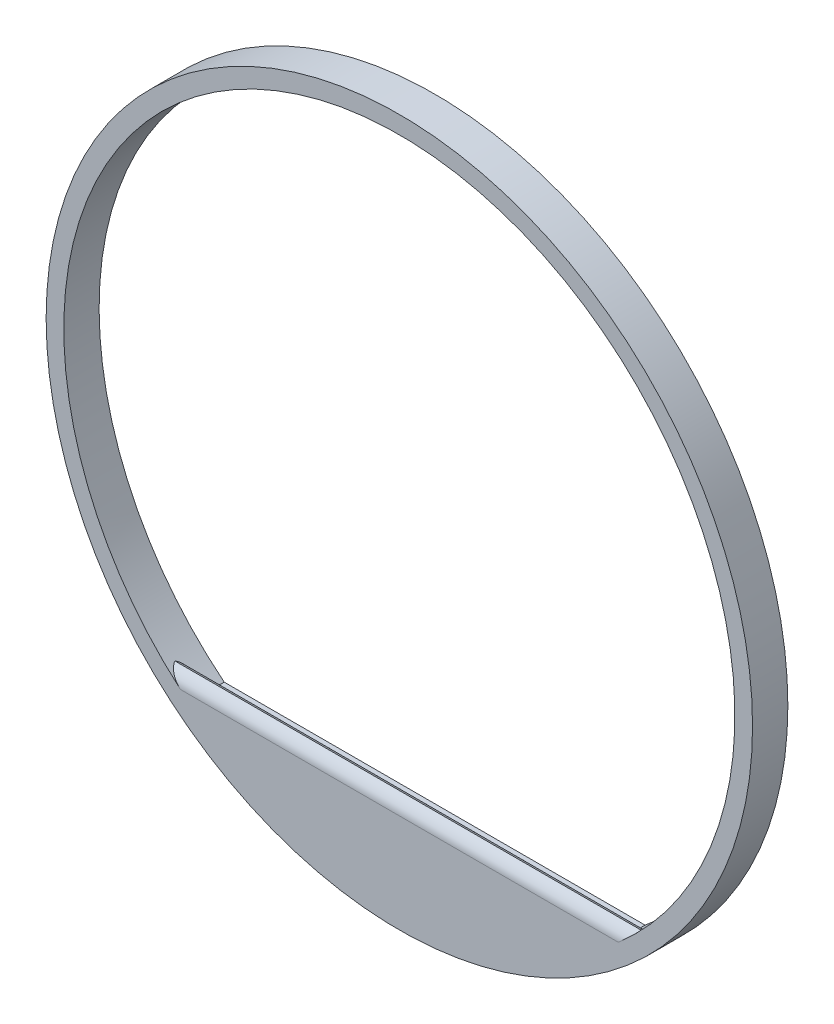
ISO-10303-21;
HEADER;
FILE_DESCRIPTION(('STEP AP214'),'2;1');
FILE_NAME('part.step','',(''),(''),'','','');
FILE_SCHEMA(('AUTOMOTIVE_DESIGN { 1 0 10303 214 1 1 1 1 }'));
ENDSEC;
DATA;
#1=APPLICATION_CONTEXT('core data for automotive mechanical design processes');
#2=APPLICATION_PROTOCOL_DEFINITION('international standard','automotive_design',2000,#1);
#3=PRODUCT_CONTEXT('',#1,'mechanical');
#4=PRODUCT('Part','Part','',(#3));
#5=PRODUCT_RELATED_PRODUCT_CATEGORY('part','',(#4));
#6=PRODUCT_DEFINITION_FORMATION('','',#4);
#7=PRODUCT_DEFINITION_CONTEXT('part definition',#1,'design');
#8=PRODUCT_DEFINITION('design','',#6,#7);
#9=PRODUCT_DEFINITION_SHAPE('','',#8);
#10=(LENGTH_UNIT() NAMED_UNIT(*) SI_UNIT(.MILLI.,.METRE.));
#11=(NAMED_UNIT(*) PLANE_ANGLE_UNIT() SI_UNIT($,.RADIAN.));
#12=(NAMED_UNIT(*) SI_UNIT($,.STERADIAN.) SOLID_ANGLE_UNIT());
#13=UNCERTAINTY_MEASURE_WITH_UNIT(LENGTH_MEASURE(1.E-05),#10,'distance_accuracy_value','');
#14=(GEOMETRIC_REPRESENTATION_CONTEXT(3) GLOBAL_UNCERTAINTY_ASSIGNED_CONTEXT((#13)) GLOBAL_UNIT_ASSIGNED_CONTEXT((#10,
#11,#12)) REPRESENTATION_CONTEXT('',''));
#15=CARTESIAN_POINT('',(0.,0.,0.));
#16=DIRECTION('',(0.,0.,1.));
#17=DIRECTION('',(1.,0.,0.));
#18=AXIS2_PLACEMENT_3D('',#15,#16,#17);
#19=CARTESIAN_POINT('',(0.,0.,5.));
#20=DIRECTION('',(0.,0.,-1.));
#21=DIRECTION('',(-1.,0.,0.));
#22=AXIS2_PLACEMENT_3D('',#19,#20,#21);
#23=CYLINDRICAL_SURFACE('',#22,47.5);
#24=CARTESIAN_POINT('',(0.,0.,2.5));
#25=DIRECTION('',(0.,0.,1.));
#26=DIRECTION('',(-1.,0.,0.));
#27=AXIS2_PLACEMENT_3D('',#24,#25,#26);
#28=CIRCLE('',#27,47.5);
#29=CARTESIAN_POINT('',(-30.9879008646923,-36.,2.5));
#30=VERTEX_POINT('',#29);
#31=CARTESIAN_POINT('',(-29.786742017213,-37.,2.5));
#32=VERTEX_POINT('',#31);
#33=EDGE_CURVE('E105',#30,#32,#28,.T.);
#34=ORIENTED_EDGE('',*,*,#33,.T.);
#35=DIRECTION('',(0.,0.,1.));
#36=VECTOR('',#35,1.);
#37=CARTESIAN_POINT('',(-29.786742017213,-37.,0.));
#38=LINE('',#37,#36);
#39=CARTESIAN_POINT('',(-29.786742017213,-37.,0.));
#40=VERTEX_POINT('',#39);
#41=EDGE_CURVE('E63',#40,#32,#38,.T.);
#42=ORIENTED_EDGE('',*,*,#41,.F.);
#43=CARTESIAN_POINT('',(0.,0.,0.));
#44=DIRECTION('',(0.,0.,1.));
#45=DIRECTION('',(1.,0.,0.));
#46=AXIS2_PLACEMENT_3D('',#43,#44,#45);
#47=CIRCLE('',#46,47.5);
#48=CARTESIAN_POINT('',(29.786742017213,-37.,0.));
#49=VERTEX_POINT('',#48);
#50=EDGE_CURVE('E103',#49,#40,#47,.T.);
#51=ORIENTED_EDGE('',*,*,#50,.F.);
#52=DIRECTION('',(0.,0.,1.));
#53=VECTOR('',#52,1.);
#54=CARTESIAN_POINT('',(29.786742017213,-37.,0.));
#55=LINE('',#54,#53);
#56=CARTESIAN_POINT('',(29.786742017213,-37.,2.5));
#57=VERTEX_POINT('',#56);
#58=EDGE_CURVE('E95',#49,#57,#55,.T.);
#59=ORIENTED_EDGE('',*,*,#58,.T.);
#60=CARTESIAN_POINT('',(30.9879008646923,-36.,2.5));
#61=VERTEX_POINT('',#60);
#62=EDGE_CURVE('E118',#57,#61,#28,.T.);
#63=ORIENTED_EDGE('',*,*,#62,.T.);
#64=CARTESIAN_POINT('',(30.9879008646923,-36.,2.5));
#65=CARTESIAN_POINT('',(31.0804636092427,-35.9203305546246,2.50003224624523));
#66=CARTESIAN_POINT('',(31.1727458486628,-35.8402687395397,2.5047639502707));
#67=CARTESIAN_POINT('',(31.3563283145713,-35.6797626068707,2.52413666541876));
#68=CARTESIAN_POINT('',(31.4476255013184,-35.5993178335172,2.53880247462999));
#69=CARTESIAN_POINT('',(31.6294423772846,-35.4378802427589,2.57879965442785));
#70=CARTESIAN_POINT('',(31.7199392082731,-35.3568926111605,2.60425821972066));
#71=CARTESIAN_POINT('',(31.8980316253527,-35.1963056653719,2.66656428675453));
#72=CARTESIAN_POINT('',(31.9856304910597,-35.1167048336852,2.70339839010275));
#73=CARTESIAN_POINT('',(32.1721660493059,-34.9459639532656,2.79702975761893));
#74=CARTESIAN_POINT('',(32.2703541645341,-34.8552845731809,2.85621037192715));
#75=CARTESIAN_POINT('',(32.4584686949563,-34.6801703530153,2.99323129069373));
#76=CARTESIAN_POINT('',(32.5484242399857,-34.595713719261,3.0710019829671));
#77=CARTESIAN_POINT('',(32.6974600250714,-34.4548130843268,3.22689967150002));
#78=CARTESIAN_POINT('',(32.7589101039224,-34.3963658464293,3.30092571498396));
#79=CARTESIAN_POINT('',(32.8723348672818,-34.2879823237665,3.46156383874093));
#80=CARTESIAN_POINT('',(32.9243181193532,-34.2380383461672,3.54816441006997));
#81=CARTESIAN_POINT('',(33.0060154659864,-34.159266275377,3.71371806625246));
#82=CARTESIAN_POINT('',(33.03811405734,-34.1282062814247,3.79042468350836));
#83=CARTESIAN_POINT('',(33.0927222390471,-34.0752576388551,3.95008577102132));
#84=CARTESIAN_POINT('',(33.1152527272824,-34.0533490043106,4.03302615440751));
#85=CARTESIAN_POINT('',(33.1446400171639,-34.0247432384635,4.1800846582437));
#86=CARTESIAN_POINT('',(33.1540904304948,-34.0155321030676,4.24320706161288));
#87=CARTESIAN_POINT('',(33.1668089609744,-34.0031293327734,4.37086085934413));
#88=CARTESIAN_POINT('',(33.1700564744355,-33.99995775912,4.43539623172097));
#89=CARTESIAN_POINT('',(33.170016581244,-34.,4.5));
#90=B_SPLINE_CURVE_WITH_KNOTS('',3,(#64,#65,#66,#67,#68,#69,#70,#71,#72,#73,#74,#75,#76,#77,#78,
#79,#80,#81,#82,#83,#84,#85,#86,#87,#88,#89),.UNSPECIFIED.,.F.,.F.,(4,2,2,2,2,2,2,2,2,2,2,2,4),
(0.,0.366356140690045,0.733630187547847,1.10535853219424,1.47665070503127,1.91386846267025,
2.34947398303526,2.68604295694289,3.02230580258558,3.28756434693401,3.5522405174856,
3.74513553909583,3.93867017829654),.UNSPECIFIED.);
#91=CARTESIAN_POINT('',(33.0197527666053,-34.1459503782259,3.74999999999942));
#92=VERTEX_POINT('',#91);
#93=EDGE_CURVE('E11',#61,#92,#90,.T.);
#94=ORIENTED_EDGE('',*,*,#93,.T.);
#95=CARTESIAN_POINT('',(33.170016581244,-34.,3.));
#96=CARTESIAN_POINT('',(33.1700271542726,-33.9999888879097,3.04429592192052));
#97=CARTESIAN_POINT('',(33.1685085316533,-34.0014712194365,3.08858354099269));
#98=CARTESIAN_POINT('',(33.1624944233472,-34.0073373791222,3.17672988920729));
#99=CARTESIAN_POINT('',(33.1580012069392,-34.0117189954531,3.22058891945184));
#100=CARTESIAN_POINT('',(33.1461689995457,-34.0232500521294,3.3071701526826));
#101=CARTESIAN_POINT('',(33.1388541725188,-34.0303759896016,3.34989880242189));
#102=CARTESIAN_POINT('',(33.1215252155992,-34.0472423834586,3.43427106023607));
#103=CARTESIAN_POINT('',(33.1115107158592,-34.0569831980733,3.47591451878507));
#104=CARTESIAN_POINT('',(33.0777332629128,-34.0898012304089,3.59855497220399));
#105=CARTESIAN_POINT('',(33.0501899862433,-34.116519410515,3.67758799441847));
#106=CARTESIAN_POINT('',(32.9866076999695,-34.1779997791252,3.82886881463863));
#107=CARTESIAN_POINT('',(32.950549859556,-34.212779794003,3.9011010695645));
#108=CARTESIAN_POINT('',(32.8555345845625,-34.3040773571662,4.06580384771332));
#109=CARTESIAN_POINT('',(32.7932174342453,-34.363693577233,4.15462156269994));
#110=CARTESIAN_POINT('',(32.6587536914469,-34.4915130228461,4.31727540242221));
#111=CARTESIAN_POINT('',(32.5865908508049,-34.5597304283462,4.39108624941843));
#112=CARTESIAN_POINT('',(32.4030765535806,-34.7320078571244,4.55289676185211));
#113=CARTESIAN_POINT('',(32.288089853591,-34.8389937155115,4.63362639832337));
#114=CARTESIAN_POINT('',(32.0489459519687,-35.0591165926268,4.76961616944717));
#115=CARTESIAN_POINT('',(31.9247604450755,-35.1722722883908,4.82479355245688));
#116=CARTESIAN_POINT('',(31.732162778453,-35.3458303801461,4.8910490686696));
#117=CARTESIAN_POINT('',(31.665720644594,-35.4053697565036,4.91056379586342));
#118=CARTESIAN_POINT('',(31.5316663051791,-35.5248091712006,4.94371731400571));
#119=CARTESIAN_POINT('',(31.4640538955682,-35.5847092712257,4.95735506925949));
#120=CARTESIAN_POINT('',(31.3286393404092,-35.7039832190017,4.97889211747302));
#121=CARTESIAN_POINT('',(31.2608451767792,-35.7633566279549,4.98684498196387));
#122=CARTESIAN_POINT('',(31.1247217622625,-35.8818877198783,4.99739251612965));
#123=CARTESIAN_POINT('',(31.0563928484523,-35.941045508931,4.9999903250203));
#124=CARTESIAN_POINT('',(30.9879008646923,-36.,5.));
#125=B_SPLINE_CURVE_WITH_KNOTS('',3,(#95,#96,#97,#98,#99,#100,#101,#102,#103,#104,#105,#106,
#107,#108,#109,#110,#111,#112,#113,#114,#115,#116,#117,#118,#119,#120,#121,#122,#123,#124),
.UNSPECIFIED.,.F.,.F.,(4,2,2,2,2,2,2,2,2,2,2,2,2,2,4),(0.,0.132823437014146,0.265545661345845,
0.397155635530541,0.528783649067747,0.791056138440036,1.05391419383023,1.42323945442886,
1.79318174879927,2.32010691145082,2.84872680260924,3.12253946046181,3.39640035241571,
3.66764522225943,3.93873103892957),.UNSPECIFIED.);
#126=CARTESIAN_POINT('',(30.9879008646923,-36.,5.));
#127=VERTEX_POINT('',#126);
#128=EDGE_CURVE('E140',#92,#127,#125,.T.);
#129=ORIENTED_EDGE('',*,*,#128,.T.);
#130=CARTESIAN_POINT('',(0.,0.,5.));
#131=DIRECTION('',(0.,0.,1.));
#132=DIRECTION('',(1.,0.,0.));
#133=AXIS2_PLACEMENT_3D('',#130,#131,#132);
#134=CIRCLE('',#133,47.5);
#135=CARTESIAN_POINT('',(-30.9879008646923,-36.,5.));
#136=VERTEX_POINT('',#135);
#137=EDGE_CURVE('E116',#127,#136,#134,.T.);
#138=ORIENTED_EDGE('',*,*,#137,.T.);
#139=CARTESIAN_POINT('',(-30.9879008646923,-36.,5.));
#140=CARTESIAN_POINT('',(-31.0804636092427,-35.9203305546246,4.99996775375477));
#141=CARTESIAN_POINT('',(-31.1727458486628,-35.8402687395397,4.9952360497293));
#142=CARTESIAN_POINT('',(-31.3563283145713,-35.6797626068707,4.97586333458124));
#143=CARTESIAN_POINT('',(-31.4476255013184,-35.5993178335172,4.96119752537));
#144=CARTESIAN_POINT('',(-31.6294423772846,-35.4378802427589,4.92120034557215));
#145=CARTESIAN_POINT('',(-31.7199392082731,-35.3568926111605,4.89574178027934));
#146=CARTESIAN_POINT('',(-31.8980316253527,-35.1963056653719,4.83343571324547));
#147=CARTESIAN_POINT('',(-31.9856304910596,-35.1167048336852,4.79660160989725));
#148=CARTESIAN_POINT('',(-32.1721660493059,-34.9459639532656,4.70297024238107));
#149=CARTESIAN_POINT('',(-32.2703541645341,-34.8552845731809,4.64378962807286));
#150=CARTESIAN_POINT('',(-32.4584686949563,-34.6801703530153,4.50676870930628));
#151=CARTESIAN_POINT('',(-32.5484242399857,-34.595713719261,4.42899801703291));
#152=CARTESIAN_POINT('',(-32.6974600250714,-34.4548130843268,4.27310032849999));
#153=CARTESIAN_POINT('',(-32.7589101039224,-34.3963658464293,4.19907428501605));
#154=CARTESIAN_POINT('',(-32.8723348672818,-34.2879823237665,4.03843616125907));
#155=CARTESIAN_POINT('',(-32.9243181193532,-34.2380383461672,3.95183558993003));
#156=CARTESIAN_POINT('',(-33.0060154659864,-34.159266275377,3.78628193374754));
#157=CARTESIAN_POINT('',(-33.03811405734,-34.1282062814247,3.70957531649164));
#158=CARTESIAN_POINT('',(-33.0927222390471,-34.0752576388551,3.54991422897868));
#159=CARTESIAN_POINT('',(-33.1152527272824,-34.0533490043106,3.46697384559249));
#160=CARTESIAN_POINT('',(-33.1446400171639,-34.0247432384635,3.3199153417563));
#161=CARTESIAN_POINT('',(-33.1540904304948,-34.0155321030676,3.25679293838712));
#162=CARTESIAN_POINT('',(-33.1668089609744,-34.0031293327733,3.12913914065587));
#163=CARTESIAN_POINT('',(-33.1700564744355,-33.99995775912,3.06460376827903));
#164=CARTESIAN_POINT('',(-33.170016581244,-34.,3.));
#165=B_SPLINE_CURVE_WITH_KNOTS('',3,(#139,#140,#141,#142,#143,#144,#145,#146,#147,#148,#149,
#150,#151,#152,#153,#154,#155,#156,#157,#158,#159,#160,#161,#162,#163,#164),.UNSPECIFIED.,.F.,
.F.,(4,2,2,2,2,2,2,2,2,2,2,2,4),(0.,0.366356140690045,0.733630187547847,1.10535853219424,
1.47665070503127,1.91386846267024,2.34947398303526,2.68604295694289,3.02230580258558,
3.28756434693401,3.5522405174856,3.74513553909583,3.93867017829654),.UNSPECIFIED.);
#166=CARTESIAN_POINT('',(-33.0197527666063,-34.145950378225,3.75000000000572));
#167=VERTEX_POINT('',#166);
#168=EDGE_CURVE('E132',#136,#167,#165,.T.);
#169=ORIENTED_EDGE('',*,*,#168,.T.);
#170=CARTESIAN_POINT('',(-33.170016581244,-34.,4.5));
#171=CARTESIAN_POINT('',(-33.1700271542726,-33.9999888879097,4.45570407807948));
#172=CARTESIAN_POINT('',(-33.1685085316533,-34.0014712194365,4.41141645900731));
#173=CARTESIAN_POINT('',(-33.1624944233472,-34.0073373791222,4.32327011079271));
#174=CARTESIAN_POINT('',(-33.1580012069392,-34.0117189954531,4.27941108054816));
#175=CARTESIAN_POINT('',(-33.1461689995457,-34.0232500521294,4.1928298473174));
#176=CARTESIAN_POINT('',(-33.1388541725188,-34.0303759896016,4.15010119757811));
#177=CARTESIAN_POINT('',(-33.1215252155992,-34.0472423834586,4.06572893976393));
#178=CARTESIAN_POINT('',(-33.1115107158592,-34.0569831980733,4.02408548121493));
#179=CARTESIAN_POINT('',(-33.0777332629128,-34.0898012304089,3.90144502779601));
#180=CARTESIAN_POINT('',(-33.0501899862433,-34.116519410515,3.82241200558153));
#181=CARTESIAN_POINT('',(-32.9866076999695,-34.1779997791252,3.67113118536137));
#182=CARTESIAN_POINT('',(-32.950549859556,-34.212779794003,3.5988989304355));
#183=CARTESIAN_POINT('',(-32.8555345845625,-34.3040773571662,3.43419615228668));
#184=CARTESIAN_POINT('',(-32.7932174342453,-34.363693577233,3.34537843730006));
#185=CARTESIAN_POINT('',(-32.6587536914469,-34.4915130228461,3.18272459757779));
#186=CARTESIAN_POINT('',(-32.5865908508049,-34.5597304283462,3.10891375058157));
#187=CARTESIAN_POINT('',(-32.4030765535806,-34.7320078571244,2.94710323814789));
#188=CARTESIAN_POINT('',(-32.288089853591,-34.8389937155115,2.86637360167664));
#189=CARTESIAN_POINT('',(-32.0489459519687,-35.0591165926268,2.73038383055284));
#190=CARTESIAN_POINT('',(-31.9247604450755,-35.1722722883908,2.67520644754312));
#191=CARTESIAN_POINT('',(-31.732162778453,-35.3458303801461,2.6089509313304));
#192=CARTESIAN_POINT('',(-31.665720644594,-35.4053697565036,2.58943620413658));
#193=CARTESIAN_POINT('',(-31.5316663051791,-35.5248091712006,2.55628268599429));
#194=CARTESIAN_POINT('',(-31.4640538955682,-35.5847092712257,2.54264493074051));
#195=CARTESIAN_POINT('',(-31.3286393404092,-35.7039832190017,2.52110788252698));
#196=CARTESIAN_POINT('',(-31.2608451767792,-35.7633566279549,2.51315501803613));
#197=CARTESIAN_POINT('',(-31.1247217622626,-35.8818877198783,2.50260748387035));
#198=CARTESIAN_POINT('',(-31.0563928484523,-35.941045508931,2.5000096749797));
#199=CARTESIAN_POINT('',(-30.9879008646923,-36.,2.5));
#200=B_SPLINE_CURVE_WITH_KNOTS('',3,(#170,#171,#172,#173,#174,#175,#176,#177,#178,#179,#180,
#181,#182,#183,#184,#185,#186,#187,#188,#189,#190,#191,#192,#193,#194,#195,#196,#197,#198,#199),
.UNSPECIFIED.,.F.,.F.,(4,2,2,2,2,2,2,2,2,2,2,2,2,2,4),(0.,0.132823437014145,0.265545661345844,
0.39715563553054,0.528783649067747,0.791056138440036,1.05391419383023,1.42323945442886,
1.79318174879927,2.32010691145082,2.84872680260924,3.12253946046181,3.39640035241571,
3.66764522225942,3.93873103892957),.UNSPECIFIED.);
#201=EDGE_CURVE('E56',#167,#30,#200,.T.);
#202=ORIENTED_EDGE('',*,*,#201,.T.);
#203=EDGE_LOOP('',(#34,#42,#51,#59,#63,#94,#129,#138,#169,#202));
#204=FACE_BOUND('',#203,.T.);
#205=ADVANCED_FACE('F45',(#204),#23,.F.);
#206=CARTESIAN_POINT('',(0.,0.,2.5));
#207=DIRECTION('',(0.,0.,-1.));
#208=DIRECTION('',(-1.,0.,0.));
#209=AXIS2_PLACEMENT_3D('',#206,#207,#208);
#210=PLANE('',#209);
#211=ORIENTED_EDGE('',*,*,#62,.F.);
#212=DIRECTION('',(1.,0.,0.));
#213=VECTOR('',#212,1.);
#214=CARTESIAN_POINT('',(29.786742017213,-37.,2.5));
#215=LINE('',#214,#213);
#216=EDGE_CURVE('E100',#32,#57,#215,.T.);
#217=ORIENTED_EDGE('',*,*,#216,.F.);
#218=ORIENTED_EDGE('',*,*,#33,.F.);
#219=DIRECTION('',(-1.,0.,0.));
#220=VECTOR('',#219,1.);
#221=CARTESIAN_POINT('',(0.,-36.,2.5));
#222=LINE('',#221,#220);
#223=EDGE_CURVE('E128',#30,#61,#222,.F.);
#224=ORIENTED_EDGE('',*,*,#223,.T.);
#225=EDGE_LOOP('',(#211,#217,#218,#224));
#226=FACE_BOUND('',#225,.T.);
#227=ADVANCED_FACE('F151',(#226),#210,.T.);
#228=CARTESIAN_POINT('',(0.,0.,5.));
#229=DIRECTION('',(0.,0.,-1.));
#230=DIRECTION('',(-1.,0.,0.));
#231=AXIS2_PLACEMENT_3D('',#228,#229,#230);
#232=CYLINDRICAL_SURFACE('',#231,50.);
#233=CARTESIAN_POINT('',(0.,0.,5.));
#234=DIRECTION('',(0.,0.,1.));
#235=DIRECTION('',(1.,0.,0.));
#236=AXIS2_PLACEMENT_3D('',#233,#234,#235);
#237=CIRCLE('',#236,50.);
#238=CARTESIAN_POINT('',(50.,0.,5.));
#239=VERTEX_POINT('',#238);
#240=EDGE_CURVE('E121',#239,#239,#237,.T.);
#241=ORIENTED_EDGE('',*,*,#240,.F.);
#242=EDGE_LOOP('',(#241));
#243=FACE_BOUND('',#242,.T.);
#244=CARTESIAN_POINT('',(0.,0.,0.));
#245=DIRECTION('',(0.,0.,1.));
#246=DIRECTION('',(1.,0.,0.));
#247=AXIS2_PLACEMENT_3D('',#244,#245,#246);
#248=CIRCLE('',#247,50.);
#249=CARTESIAN_POINT('',(50.,0.,0.));
#250=VERTEX_POINT('',#249);
#251=EDGE_CURVE('E111',#250,#250,#248,.T.);
#252=ORIENTED_EDGE('',*,*,#251,.T.);
#253=EDGE_LOOP('',(#252));
#254=FACE_BOUND('',#253,.T.);
#255=ADVANCED_FACE('F152',(#243,#254),#232,.T.);
#256=CARTESIAN_POINT('',(0.,0.,5.));
#257=DIRECTION('',(0.,0.,1.));
#258=DIRECTION('',(1.,0.,0.));
#259=AXIS2_PLACEMENT_3D('',#256,#257,#258);
#260=PLANE('',#259);
#261=DIRECTION('',(-1.,0.,0.));
#262=VECTOR('',#261,1.);
#263=CARTESIAN_POINT('',(0.,-36.,5.));
#264=LINE('',#263,#262);
#265=EDGE_CURVE('E124',#127,#136,#264,.T.);
#266=ORIENTED_EDGE('',*,*,#265,.T.);
#267=ORIENTED_EDGE('',*,*,#137,.F.);
#268=EDGE_LOOP('',(#266,#267));
#269=FACE_BOUND('',#268,.T.);
#270=ORIENTED_EDGE('',*,*,#240,.T.);
#271=EDGE_LOOP('',(#270));
#272=FACE_BOUND('',#271,.T.);
#273=ADVANCED_FACE('F174',(#269,#272),#260,.T.);
#274=CARTESIAN_POINT('',(0.,0.,0.));
#275=DIRECTION('',(0.,0.,1.));
#276=DIRECTION('',(1.,0.,0.));
#277=AXIS2_PLACEMENT_3D('',#274,#275,#276);
#278=PLANE('',#277);
#279=ORIENTED_EDGE('',*,*,#50,.T.);
#280=DIRECTION('',(1.,0.,0.));
#281=VECTOR('',#280,1.);
#282=CARTESIAN_POINT('',(29.786742017213,-37.,0.));
#283=LINE('',#282,#281);
#284=EDGE_CURVE('E92',#40,#49,#283,.T.);
#285=ORIENTED_EDGE('',*,*,#284,.T.);
#286=EDGE_LOOP('',(#279,#285));
#287=FACE_BOUND('',#286,.T.);
#288=ORIENTED_EDGE('',*,*,#251,.F.);
#289=EDGE_LOOP('',(#288));
#290=FACE_BOUND('',#289,.T.);
#291=ADVANCED_FACE('F108',(#287,#290),#278,.F.);
#292=CARTESIAN_POINT('',(-33.170016581244,-36.,4.5));
#293=DIRECTION('',(-1.,0.,0.));
#294=DIRECTION('',(0.,0.,1.));
#295=AXIS2_PLACEMENT_3D('',#292,#293,#294);
#296=CYLINDRICAL_SURFACE('',#295,2.);
#297=DIRECTION('',(-1.,0.,0.));
#298=VECTOR('',#297,1.);
#299=CARTESIAN_POINT('',(0.,-34.1459503782261,3.75));
#300=LINE('',#299,#298);
#301=EDGE_CURVE('E50',#92,#167,#300,.T.);
#302=ORIENTED_EDGE('',*,*,#301,.F.);
#303=ORIENTED_EDGE('',*,*,#93,.F.);
#304=ORIENTED_EDGE('',*,*,#223,.F.);
#305=ORIENTED_EDGE('',*,*,#201,.F.);
#306=EDGE_LOOP('',(#302,#303,#304,#305));
#307=FACE_BOUND('',#306,.T.);
#308=ADVANCED_FACE('F47',(#307),#296,.T.);
#309=CARTESIAN_POINT('',(0.,-36.,3.));
#310=DIRECTION('',(-1.,0.,0.));
#311=DIRECTION('',(0.,0.,1.));
#312=AXIS2_PLACEMENT_3D('',#309,#310,#311);
#313=CYLINDRICAL_SURFACE('',#312,2.);
#314=ORIENTED_EDGE('',*,*,#128,.F.);
#315=ORIENTED_EDGE('',*,*,#301,.T.);
#316=ORIENTED_EDGE('',*,*,#168,.F.);
#317=ORIENTED_EDGE('',*,*,#265,.F.);
#318=EDGE_LOOP('',(#314,#315,#316,#317));
#319=FACE_BOUND('',#318,.T.);
#320=ADVANCED_FACE('F146',(#319),#313,.T.);
#321=CARTESIAN_POINT('',(29.786742017213,-37.,0.));
#322=DIRECTION('',(0.,-1.,0.));
#323=DIRECTION('',(0.,0.,-1.));
#324=AXIS2_PLACEMENT_3D('',#321,#322,#323);
#325=PLANE('',#324);
#326=ORIENTED_EDGE('',*,*,#216,.T.);
#327=ORIENTED_EDGE('',*,*,#58,.F.);
#328=ORIENTED_EDGE('',*,*,#284,.F.);
#329=ORIENTED_EDGE('',*,*,#41,.T.);
#330=EDGE_LOOP('',(#326,#327,#328,#329));
#331=FACE_BOUND('',#330,.T.);
#332=ADVANCED_FACE('F93',(#331),#325,.F.);
#333=CLOSED_SHELL('',(#205,#227,#255,#273,#291,#308,#320,#332));
#334=MANIFOLD_SOLID_BREP('B2',#333);
#335=ADVANCED_BREP_SHAPE_REPRESENTATION('',(#18,#334),#14);
#336=SHAPE_DEFINITION_REPRESENTATION(#9,#335);
ENDSEC;
END-ISO-10303-21;
